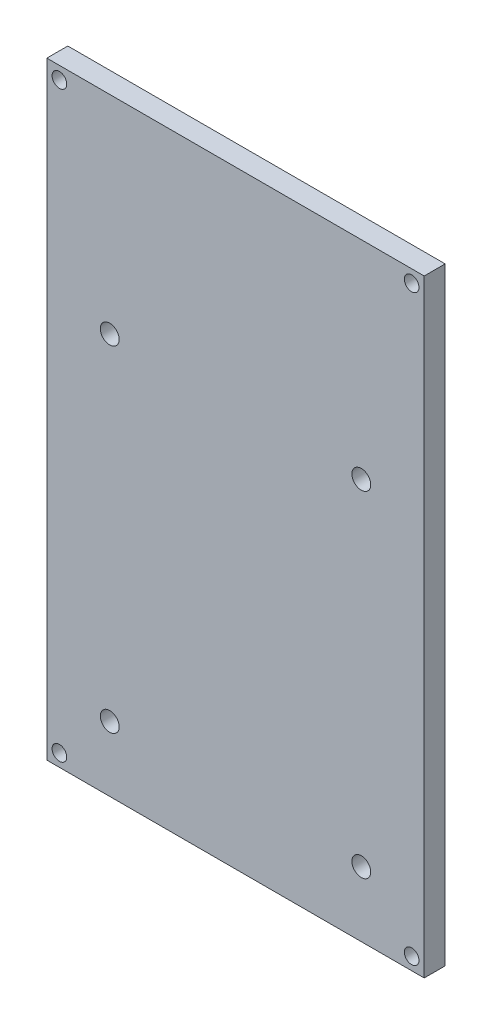
ISO-10303-21;
HEADER;
FILE_DESCRIPTION(('STEP AP214'),'2;1');
FILE_NAME('part.step','',(''),(''),'','','');
FILE_SCHEMA(('AUTOMOTIVE_DESIGN { 1 0 10303 214 1 1 1 1 }'));
ENDSEC;
DATA;
#1=APPLICATION_CONTEXT('core data for automotive mechanical design processes');
#2=APPLICATION_PROTOCOL_DEFINITION('international standard','automotive_design',2000,#1);
#3=PRODUCT_CONTEXT('',#1,'mechanical');
#4=PRODUCT('Part','Part','',(#3));
#5=PRODUCT_RELATED_PRODUCT_CATEGORY('part','',(#4));
#6=PRODUCT_DEFINITION_FORMATION('','',#4);
#7=PRODUCT_DEFINITION_CONTEXT('part definition',#1,'design');
#8=PRODUCT_DEFINITION('design','',#6,#7);
#9=PRODUCT_DEFINITION_SHAPE('','',#8);
#10=(LENGTH_UNIT() NAMED_UNIT(*) SI_UNIT(.MILLI.,.METRE.));
#11=(NAMED_UNIT(*) PLANE_ANGLE_UNIT() SI_UNIT($,.RADIAN.));
#12=(NAMED_UNIT(*) SI_UNIT($,.STERADIAN.) SOLID_ANGLE_UNIT());
#13=UNCERTAINTY_MEASURE_WITH_UNIT(LENGTH_MEASURE(1.E-05),#10,'distance_accuracy_value','');
#14=(GEOMETRIC_REPRESENTATION_CONTEXT(3) GLOBAL_UNCERTAINTY_ASSIGNED_CONTEXT((#13)) GLOBAL_UNIT_ASSIGNED_CONTEXT((#10,
#11,#12)) REPRESENTATION_CONTEXT('',''));
#15=CARTESIAN_POINT('',(0.,0.,0.));
#16=DIRECTION('',(0.,0.,1.));
#17=DIRECTION('',(1.,0.,0.));
#18=AXIS2_PLACEMENT_3D('',#15,#16,#17);
#19=CARTESIAN_POINT('',(45.,-72.5,5.));
#20=DIRECTION('',(-1.,0.,0.));
#21=DIRECTION('',(0.,0.,1.));
#22=AXIS2_PLACEMENT_3D('',#19,#20,#21);
#23=PLANE('',#22);
#24=DIRECTION('',(0.,1.,0.));
#25=VECTOR('',#24,1.);
#26=CARTESIAN_POINT('',(45.,-72.5,0.));
#27=LINE('',#26,#25);
#28=CARTESIAN_POINT('',(45.,-72.5,0.));
#29=VERTEX_POINT('',#28);
#30=CARTESIAN_POINT('',(45.,72.5,0.));
#31=VERTEX_POINT('',#30);
#32=EDGE_CURVE('E106',#29,#31,#27,.T.);
#33=ORIENTED_EDGE('',*,*,#32,.T.);
#34=DIRECTION('',(0.,0.,-1.));
#35=VECTOR('',#34,1.);
#36=CARTESIAN_POINT('',(45.,72.5,5.));
#37=LINE('',#36,#35);
#38=CARTESIAN_POINT('',(45.,72.5,5.));
#39=VERTEX_POINT('',#38);
#40=EDGE_CURVE('E11',#39,#31,#37,.T.);
#41=ORIENTED_EDGE('',*,*,#40,.F.);
#42=DIRECTION('',(0.,1.,0.));
#43=VECTOR('',#42,1.);
#44=CARTESIAN_POINT('',(45.,-72.5,5.));
#45=LINE('',#44,#43);
#46=CARTESIAN_POINT('',(45.,-72.5,5.));
#47=VERTEX_POINT('',#46);
#48=EDGE_CURVE('E90',#47,#39,#45,.T.);
#49=ORIENTED_EDGE('',*,*,#48,.F.);
#50=DIRECTION('',(0.,0.,-1.));
#51=VECTOR('',#50,1.);
#52=CARTESIAN_POINT('',(45.,-72.5,5.));
#53=LINE('',#52,#51);
#54=EDGE_CURVE('E102',#47,#29,#53,.T.);
#55=ORIENTED_EDGE('',*,*,#54,.T.);
#56=EDGE_LOOP('',(#33,#41,#49,#55));
#57=FACE_BOUND('',#56,.T.);
#58=ADVANCED_FACE('F38',(#57),#23,.F.);
#59=CARTESIAN_POINT('',(-45.,72.5,5.));
#60=DIRECTION('',(0.,-1.,0.));
#61=DIRECTION('',(0.,0.,-1.));
#62=AXIS2_PLACEMENT_3D('',#59,#60,#61);
#63=PLANE('',#62);
#64=DIRECTION('',(-1.,0.,0.));
#65=VECTOR('',#64,1.);
#66=CARTESIAN_POINT('',(-45.,72.5,0.));
#67=LINE('',#66,#65);
#68=CARTESIAN_POINT('',(-45.,72.5,0.));
#69=VERTEX_POINT('',#68);
#70=EDGE_CURVE('E95',#31,#69,#67,.T.);
#71=ORIENTED_EDGE('',*,*,#70,.T.);
#72=DIRECTION('',(0.,0.,-1.));
#73=VECTOR('',#72,1.);
#74=CARTESIAN_POINT('',(-45.,72.5,5.));
#75=LINE('',#74,#73);
#76=CARTESIAN_POINT('',(-45.,72.5,5.));
#77=VERTEX_POINT('',#76);
#78=EDGE_CURVE('E47',#77,#69,#75,.T.);
#79=ORIENTED_EDGE('',*,*,#78,.F.);
#80=DIRECTION('',(-1.,0.,0.));
#81=VECTOR('',#80,1.);
#82=CARTESIAN_POINT('',(-45.,72.5,5.));
#83=LINE('',#82,#81);
#84=EDGE_CURVE('E85',#39,#77,#83,.T.);
#85=ORIENTED_EDGE('',*,*,#84,.F.);
#86=ORIENTED_EDGE('',*,*,#40,.T.);
#87=EDGE_LOOP('',(#71,#79,#85,#86));
#88=FACE_BOUND('',#87,.T.);
#89=ADVANCED_FACE('F94',(#88),#63,.F.);
#90=CARTESIAN_POINT('',(-45.,-72.5,5.));
#91=DIRECTION('',(1.,0.,0.));
#92=DIRECTION('',(0.,0.,-1.));
#93=AXIS2_PLACEMENT_3D('',#90,#91,#92);
#94=PLANE('',#93);
#95=DIRECTION('',(0.,-1.,0.));
#96=VECTOR('',#95,1.);
#97=CARTESIAN_POINT('',(-45.,-72.5,0.));
#98=LINE('',#97,#96);
#99=CARTESIAN_POINT('',(-45.,-72.5,0.));
#100=VERTEX_POINT('',#99);
#101=EDGE_CURVE('E72',#69,#100,#98,.T.);
#102=ORIENTED_EDGE('',*,*,#101,.T.);
#103=DIRECTION('',(0.,0.,-1.));
#104=VECTOR('',#103,1.);
#105=CARTESIAN_POINT('',(-45.,-72.5,5.));
#106=LINE('',#105,#104);
#107=CARTESIAN_POINT('',(-45.,-72.5,5.));
#108=VERTEX_POINT('',#107);
#109=EDGE_CURVE('E97',#108,#100,#106,.T.);
#110=ORIENTED_EDGE('',*,*,#109,.F.);
#111=DIRECTION('',(0.,-1.,0.));
#112=VECTOR('',#111,1.);
#113=CARTESIAN_POINT('',(-45.,-72.5,5.));
#114=LINE('',#113,#112);
#115=EDGE_CURVE('E88',#77,#108,#114,.T.);
#116=ORIENTED_EDGE('',*,*,#115,.F.);
#117=ORIENTED_EDGE('',*,*,#78,.T.);
#118=EDGE_LOOP('',(#102,#110,#116,#117));
#119=FACE_BOUND('',#118,.T.);
#120=ADVANCED_FACE('F98',(#119),#94,.F.);
#121=CARTESIAN_POINT('',(-45.,-72.5,5.));
#122=DIRECTION('',(0.,1.,0.));
#123=DIRECTION('',(0.,0.,1.));
#124=AXIS2_PLACEMENT_3D('',#121,#122,#123);
#125=PLANE('',#124);
#126=DIRECTION('',(1.,0.,0.));
#127=VECTOR('',#126,1.);
#128=CARTESIAN_POINT('',(-45.,-72.5,0.));
#129=LINE('',#128,#127);
#130=EDGE_CURVE('E78',#100,#29,#129,.T.);
#131=ORIENTED_EDGE('',*,*,#130,.T.);
#132=ORIENTED_EDGE('',*,*,#54,.F.);
#133=DIRECTION('',(1.,0.,0.));
#134=VECTOR('',#133,1.);
#135=CARTESIAN_POINT('',(-45.,-72.5,5.));
#136=LINE('',#135,#134);
#137=EDGE_CURVE('E55',#108,#47,#136,.T.);
#138=ORIENTED_EDGE('',*,*,#137,.F.);
#139=ORIENTED_EDGE('',*,*,#109,.T.);
#140=EDGE_LOOP('',(#131,#132,#138,#139));
#141=FACE_BOUND('',#140,.T.);
#142=ADVANCED_FACE('F120',(#141),#125,.F.);
#143=CARTESIAN_POINT('',(0.,0.,5.));
#144=DIRECTION('',(0.,0.,-1.));
#145=DIRECTION('',(-1.,0.,0.));
#146=AXIS2_PLACEMENT_3D('',#143,#144,#145);
#147=PLANE('',#146);
#148=CARTESIAN_POINT('',(30.0000000000001,-56.9999999999999,5.));
#149=DIRECTION('',(0.,0.,-1.));
#150=DIRECTION('',(1.,0.,0.));
#151=AXIS2_PLACEMENT_3D('',#148,#149,#150);
#152=CIRCLE('',#151,2.25);
#153=CARTESIAN_POINT('',(32.2500000000001,-56.9999999999999,5.));
#154=VERTEX_POINT('',#153);
#155=EDGE_CURVE('E171',#154,#154,#152,.T.);
#156=ORIENTED_EDGE('',*,*,#155,.T.);
#157=EDGE_LOOP('',(#156));
#158=FACE_BOUND('',#157,.T.);
#159=CARTESIAN_POINT('',(-29.9999999999999,-57.,5.));
#160=DIRECTION('',(0.,0.,-1.));
#161=DIRECTION('',(-1.,0.,0.));
#162=AXIS2_PLACEMENT_3D('',#159,#160,#161);
#163=CIRCLE('',#162,2.25);
#164=CARTESIAN_POINT('',(-32.2499999999999,-57.,5.));
#165=VERTEX_POINT('',#164);
#166=EDGE_CURVE('E179',#165,#165,#163,.T.);
#167=ORIENTED_EDGE('',*,*,#166,.T.);
#168=EDGE_LOOP('',(#167));
#169=FACE_BOUND('',#168,.T.);
#170=CARTESIAN_POINT('',(-30.,23.,5.));
#171=DIRECTION('',(0.,0.,-1.));
#172=DIRECTION('',(1.,0.,0.));
#173=AXIS2_PLACEMENT_3D('',#170,#171,#172);
#174=CIRCLE('',#173,2.25);
#175=CARTESIAN_POINT('',(-27.75,23.,5.));
#176=VERTEX_POINT('',#175);
#177=EDGE_CURVE('E163',#176,#176,#174,.T.);
#178=ORIENTED_EDGE('',*,*,#177,.T.);
#179=EDGE_LOOP('',(#178));
#180=FACE_BOUND('',#179,.T.);
#181=CARTESIAN_POINT('',(30.,23.,5.));
#182=DIRECTION('',(0.,0.,-1.));
#183=DIRECTION('',(-1.,0.,0.));
#184=AXIS2_PLACEMENT_3D('',#181,#182,#183);
#185=CIRCLE('',#184,2.25);
#186=CARTESIAN_POINT('',(27.75,23.,5.));
#187=VERTEX_POINT('',#186);
#188=EDGE_CURVE('E155',#187,#187,#185,.T.);
#189=ORIENTED_EDGE('',*,*,#188,.T.);
#190=EDGE_LOOP('',(#189));
#191=FACE_BOUND('',#190,.T.);
#192=CARTESIAN_POINT('',(42.,-69.5,5.));
#193=DIRECTION('',(0.,0.,-1.));
#194=DIRECTION('',(1.,0.,0.));
#195=AXIS2_PLACEMENT_3D('',#192,#193,#194);
#196=CIRCLE('',#195,1.75);
#197=CARTESIAN_POINT('',(43.75,-69.5,5.));
#198=VERTEX_POINT('',#197);
#199=EDGE_CURVE('E131',#198,#198,#196,.T.);
#200=ORIENTED_EDGE('',*,*,#199,.T.);
#201=EDGE_LOOP('',(#200));
#202=FACE_BOUND('',#201,.T.);
#203=CARTESIAN_POINT('',(-42.,69.5,5.));
#204=DIRECTION('',(0.,0.,-1.));
#205=DIRECTION('',(1.,0.,0.));
#206=AXIS2_PLACEMENT_3D('',#203,#204,#205);
#207=CIRCLE('',#206,1.75);
#208=CARTESIAN_POINT('',(-40.2499999999999,69.5,5.));
#209=VERTEX_POINT('',#208);
#210=EDGE_CURVE('E139',#209,#209,#207,.T.);
#211=ORIENTED_EDGE('',*,*,#210,.T.);
#212=EDGE_LOOP('',(#211));
#213=FACE_BOUND('',#212,.T.);
#214=CARTESIAN_POINT('',(-42.,-69.5,5.));
#215=DIRECTION('',(0.,0.,-1.));
#216=DIRECTION('',(-1.,0.,0.));
#217=AXIS2_PLACEMENT_3D('',#214,#215,#216);
#218=CIRCLE('',#217,1.75);
#219=CARTESIAN_POINT('',(-43.75,-69.5,5.));
#220=VERTEX_POINT('',#219);
#221=EDGE_CURVE('E140',#220,#220,#218,.T.);
#222=ORIENTED_EDGE('',*,*,#221,.T.);
#223=EDGE_LOOP('',(#222));
#224=FACE_BOUND('',#223,.T.);
#225=CARTESIAN_POINT('',(42.,69.5,5.));
#226=DIRECTION('',(0.,0.,-1.));
#227=DIRECTION('',(-1.,0.,0.));
#228=AXIS2_PLACEMENT_3D('',#225,#226,#227);
#229=CIRCLE('',#228,1.75);
#230=CARTESIAN_POINT('',(40.25,69.5,5.));
#231=VERTEX_POINT('',#230);
#232=EDGE_CURVE('E110',#231,#231,#229,.T.);
#233=ORIENTED_EDGE('',*,*,#232,.T.);
#234=EDGE_LOOP('',(#233));
#235=FACE_BOUND('',#234,.T.);
#236=ORIENTED_EDGE('',*,*,#48,.T.);
#237=ORIENTED_EDGE('',*,*,#84,.T.);
#238=ORIENTED_EDGE('',*,*,#115,.T.);
#239=ORIENTED_EDGE('',*,*,#137,.T.);
#240=EDGE_LOOP('',(#236,#237,#238,#239));
#241=FACE_BOUND('',#240,.T.);
#242=ADVANCED_FACE('F86',(#158,#169,#180,#191,#202,#213,#224,#235,#241),#147,.F.);
#243=CARTESIAN_POINT('',(0.,0.,0.));
#244=DIRECTION('',(0.,0.,-1.));
#245=DIRECTION('',(-1.,0.,0.));
#246=AXIS2_PLACEMENT_3D('',#243,#244,#245);
#247=PLANE('',#246);
#248=CARTESIAN_POINT('',(30.0000000000001,-56.9999999999999,0.));
#249=DIRECTION('',(0.,0.,-1.));
#250=DIRECTION('',(1.,0.,0.));
#251=AXIS2_PLACEMENT_3D('',#248,#249,#250);
#252=CIRCLE('',#251,2.25);
#253=CARTESIAN_POINT('',(32.2500000000001,-56.9999999999999,0.));
#254=VERTEX_POINT('',#253);
#255=EDGE_CURVE('E167',#254,#254,#252,.T.);
#256=ORIENTED_EDGE('',*,*,#255,.F.);
#257=EDGE_LOOP('',(#256));
#258=FACE_BOUND('',#257,.T.);
#259=CARTESIAN_POINT('',(-29.9999999999999,-57.,0.));
#260=DIRECTION('',(0.,0.,-1.));
#261=DIRECTION('',(-1.,0.,0.));
#262=AXIS2_PLACEMENT_3D('',#259,#260,#261);
#263=CIRCLE('',#262,2.25);
#264=CARTESIAN_POINT('',(-32.2499999999999,-57.,0.));
#265=VERTEX_POINT('',#264);
#266=EDGE_CURVE('E175',#265,#265,#263,.T.);
#267=ORIENTED_EDGE('',*,*,#266,.F.);
#268=EDGE_LOOP('',(#267));
#269=FACE_BOUND('',#268,.T.);
#270=CARTESIAN_POINT('',(-30.,23.,0.));
#271=DIRECTION('',(0.,0.,-1.));
#272=DIRECTION('',(1.,0.,0.));
#273=AXIS2_PLACEMENT_3D('',#270,#271,#272);
#274=CIRCLE('',#273,2.25);
#275=CARTESIAN_POINT('',(-27.75,23.,0.));
#276=VERTEX_POINT('',#275);
#277=EDGE_CURVE('E183',#276,#276,#274,.T.);
#278=ORIENTED_EDGE('',*,*,#277,.F.);
#279=EDGE_LOOP('',(#278));
#280=FACE_BOUND('',#279,.T.);
#281=CARTESIAN_POINT('',(30.,23.,0.));
#282=DIRECTION('',(0.,0.,-1.));
#283=DIRECTION('',(-1.,0.,0.));
#284=AXIS2_PLACEMENT_3D('',#281,#282,#283);
#285=CIRCLE('',#284,2.25);
#286=CARTESIAN_POINT('',(27.75,23.,0.));
#287=VERTEX_POINT('',#286);
#288=EDGE_CURVE('E159',#287,#287,#285,.T.);
#289=ORIENTED_EDGE('',*,*,#288,.F.);
#290=EDGE_LOOP('',(#289));
#291=FACE_BOUND('',#290,.T.);
#292=CARTESIAN_POINT('',(42.,-69.5,0.));
#293=DIRECTION('',(0.,0.,-1.));
#294=DIRECTION('',(1.,0.,0.));
#295=AXIS2_PLACEMENT_3D('',#292,#293,#294);
#296=CIRCLE('',#295,1.75);
#297=CARTESIAN_POINT('',(43.75,-69.5,0.));
#298=VERTEX_POINT('',#297);
#299=EDGE_CURVE('E144',#298,#298,#296,.T.);
#300=ORIENTED_EDGE('',*,*,#299,.F.);
#301=EDGE_LOOP('',(#300));
#302=FACE_BOUND('',#301,.T.);
#303=CARTESIAN_POINT('',(-42.,69.5,0.));
#304=DIRECTION('',(0.,0.,-1.));
#305=DIRECTION('',(1.,0.,0.));
#306=AXIS2_PLACEMENT_3D('',#303,#304,#305);
#307=CIRCLE('',#306,1.75);
#308=CARTESIAN_POINT('',(-40.2499999999999,69.5,0.));
#309=VERTEX_POINT('',#308);
#310=EDGE_CURVE('E135',#309,#309,#307,.T.);
#311=ORIENTED_EDGE('',*,*,#310,.F.);
#312=EDGE_LOOP('',(#311));
#313=FACE_BOUND('',#312,.T.);
#314=CARTESIAN_POINT('',(-42.,-69.5,0.));
#315=DIRECTION('',(0.,0.,-1.));
#316=DIRECTION('',(-1.,0.,0.));
#317=AXIS2_PLACEMENT_3D('',#314,#315,#316);
#318=CIRCLE('',#317,1.75);
#319=CARTESIAN_POINT('',(-43.75,-69.5,0.));
#320=VERTEX_POINT('',#319);
#321=EDGE_CURVE('E151',#320,#320,#318,.T.);
#322=ORIENTED_EDGE('',*,*,#321,.F.);
#323=EDGE_LOOP('',(#322));
#324=FACE_BOUND('',#323,.T.);
#325=CARTESIAN_POINT('',(42.,69.5,0.));
#326=DIRECTION('',(0.,0.,-1.));
#327=DIRECTION('',(-1.,0.,0.));
#328=AXIS2_PLACEMENT_3D('',#325,#326,#327);
#329=CIRCLE('',#328,1.75);
#330=CARTESIAN_POINT('',(40.25,69.5,0.));
#331=VERTEX_POINT('',#330);
#332=EDGE_CURVE('E127',#331,#331,#329,.T.);
#333=ORIENTED_EDGE('',*,*,#332,.F.);
#334=EDGE_LOOP('',(#333));
#335=FACE_BOUND('',#334,.T.);
#336=ORIENTED_EDGE('',*,*,#32,.F.);
#337=ORIENTED_EDGE('',*,*,#130,.F.);
#338=ORIENTED_EDGE('',*,*,#101,.F.);
#339=ORIENTED_EDGE('',*,*,#70,.F.);
#340=EDGE_LOOP('',(#336,#337,#338,#339));
#341=FACE_BOUND('',#340,.T.);
#342=ADVANCED_FACE('F123',(#258,#269,#280,#291,#302,#313,#324,#335,#341),#247,.T.);
#343=CARTESIAN_POINT('',(42.,69.5,5.));
#344=DIRECTION('',(0.,0.,-1.));
#345=DIRECTION('',(-1.,0.,0.));
#346=AXIS2_PLACEMENT_3D('',#343,#344,#345);
#347=CYLINDRICAL_SURFACE('',#346,1.75);
#348=ORIENTED_EDGE('',*,*,#232,.F.);
#349=EDGE_LOOP('',(#348));
#350=FACE_BOUND('',#349,.T.);
#351=ORIENTED_EDGE('',*,*,#332,.T.);
#352=EDGE_LOOP('',(#351));
#353=FACE_BOUND('',#352,.T.);
#354=ADVANCED_FACE('F203',(#350,#353),#347,.F.);
#355=CARTESIAN_POINT('',(-42.,-69.5,5.));
#356=DIRECTION('',(0.,0.,-1.));
#357=DIRECTION('',(-1.,0.,0.));
#358=AXIS2_PLACEMENT_3D('',#355,#356,#357);
#359=CYLINDRICAL_SURFACE('',#358,1.75);
#360=ORIENTED_EDGE('',*,*,#221,.F.);
#361=EDGE_LOOP('',(#360));
#362=FACE_BOUND('',#361,.T.);
#363=ORIENTED_EDGE('',*,*,#321,.T.);
#364=EDGE_LOOP('',(#363));
#365=FACE_BOUND('',#364,.T.);
#366=ADVANCED_FACE('F217',(#362,#365),#359,.F.);
#367=CARTESIAN_POINT('',(-42.,69.5,5.));
#368=DIRECTION('',(0.,0.,-1.));
#369=DIRECTION('',(-1.,0.,0.));
#370=AXIS2_PLACEMENT_3D('',#367,#368,#369);
#371=CYLINDRICAL_SURFACE('',#370,1.75);
#372=ORIENTED_EDGE('',*,*,#210,.F.);
#373=EDGE_LOOP('',(#372));
#374=FACE_BOUND('',#373,.T.);
#375=ORIENTED_EDGE('',*,*,#310,.T.);
#376=EDGE_LOOP('',(#375));
#377=FACE_BOUND('',#376,.T.);
#378=ADVANCED_FACE('F224',(#374,#377),#371,.F.);
#379=CARTESIAN_POINT('',(42.,-69.5,5.));
#380=DIRECTION('',(0.,0.,-1.));
#381=DIRECTION('',(-1.,0.,0.));
#382=AXIS2_PLACEMENT_3D('',#379,#380,#381);
#383=CYLINDRICAL_SURFACE('',#382,1.75);
#384=ORIENTED_EDGE('',*,*,#199,.F.);
#385=EDGE_LOOP('',(#384));
#386=FACE_BOUND('',#385,.T.);
#387=ORIENTED_EDGE('',*,*,#299,.T.);
#388=EDGE_LOOP('',(#387));
#389=FACE_BOUND('',#388,.T.);
#390=ADVANCED_FACE('F262',(#386,#389),#383,.F.);
#391=CARTESIAN_POINT('',(30.,23.,5.));
#392=DIRECTION('',(0.,0.,-1.));
#393=DIRECTION('',(-1.,0.,0.));
#394=AXIS2_PLACEMENT_3D('',#391,#392,#393);
#395=CYLINDRICAL_SURFACE('',#394,2.25);
#396=ORIENTED_EDGE('',*,*,#188,.F.);
#397=EDGE_LOOP('',(#396));
#398=FACE_BOUND('',#397,.T.);
#399=ORIENTED_EDGE('',*,*,#288,.T.);
#400=EDGE_LOOP('',(#399));
#401=FACE_BOUND('',#400,.T.);
#402=ADVANCED_FACE('F197',(#398,#401),#395,.F.);
#403=CARTESIAN_POINT('',(-30.,23.,5.));
#404=DIRECTION('',(0.,0.,-1.));
#405=DIRECTION('',(-1.,0.,0.));
#406=AXIS2_PLACEMENT_3D('',#403,#404,#405);
#407=CYLINDRICAL_SURFACE('',#406,2.25);
#408=ORIENTED_EDGE('',*,*,#177,.F.);
#409=EDGE_LOOP('',(#408));
#410=FACE_BOUND('',#409,.T.);
#411=ORIENTED_EDGE('',*,*,#277,.T.);
#412=EDGE_LOOP('',(#411));
#413=FACE_BOUND('',#412,.T.);
#414=ADVANCED_FACE('F193',(#410,#413),#407,.F.);
#415=CARTESIAN_POINT('',(-29.9999999999999,-57.,5.));
#416=DIRECTION('',(0.,0.,-1.));
#417=DIRECTION('',(-1.,0.,0.));
#418=AXIS2_PLACEMENT_3D('',#415,#416,#417);
#419=CYLINDRICAL_SURFACE('',#418,2.25);
#420=ORIENTED_EDGE('',*,*,#166,.F.);
#421=EDGE_LOOP('',(#420));
#422=FACE_BOUND('',#421,.T.);
#423=ORIENTED_EDGE('',*,*,#266,.T.);
#424=EDGE_LOOP('',(#423));
#425=FACE_BOUND('',#424,.T.);
#426=ADVANCED_FACE('F196',(#422,#425),#419,.F.);
#427=CARTESIAN_POINT('',(30.0000000000001,-56.9999999999999,5.));
#428=DIRECTION('',(0.,0.,-1.));
#429=DIRECTION('',(-1.,0.,0.));
#430=AXIS2_PLACEMENT_3D('',#427,#428,#429);
#431=CYLINDRICAL_SURFACE('',#430,2.25);
#432=ORIENTED_EDGE('',*,*,#155,.F.);
#433=EDGE_LOOP('',(#432));
#434=FACE_BOUND('',#433,.T.);
#435=ORIENTED_EDGE('',*,*,#255,.T.);
#436=EDGE_LOOP('',(#435));
#437=FACE_BOUND('',#436,.T.);
#438=ADVANCED_FACE('F251',(#434,#437),#431,.F.);
#439=CLOSED_SHELL('',(#58,#89,#120,#142,#242,#342,#354,#366,#378,#390,#402,#414,#426,#438));
#440=MANIFOLD_SOLID_BREP('B2',#439);
#441=ADVANCED_BREP_SHAPE_REPRESENTATION('',(#18,#440),#14);
#442=SHAPE_DEFINITION_REPRESENTATION(#9,#441);
ENDSEC;
END-ISO-10303-21;
